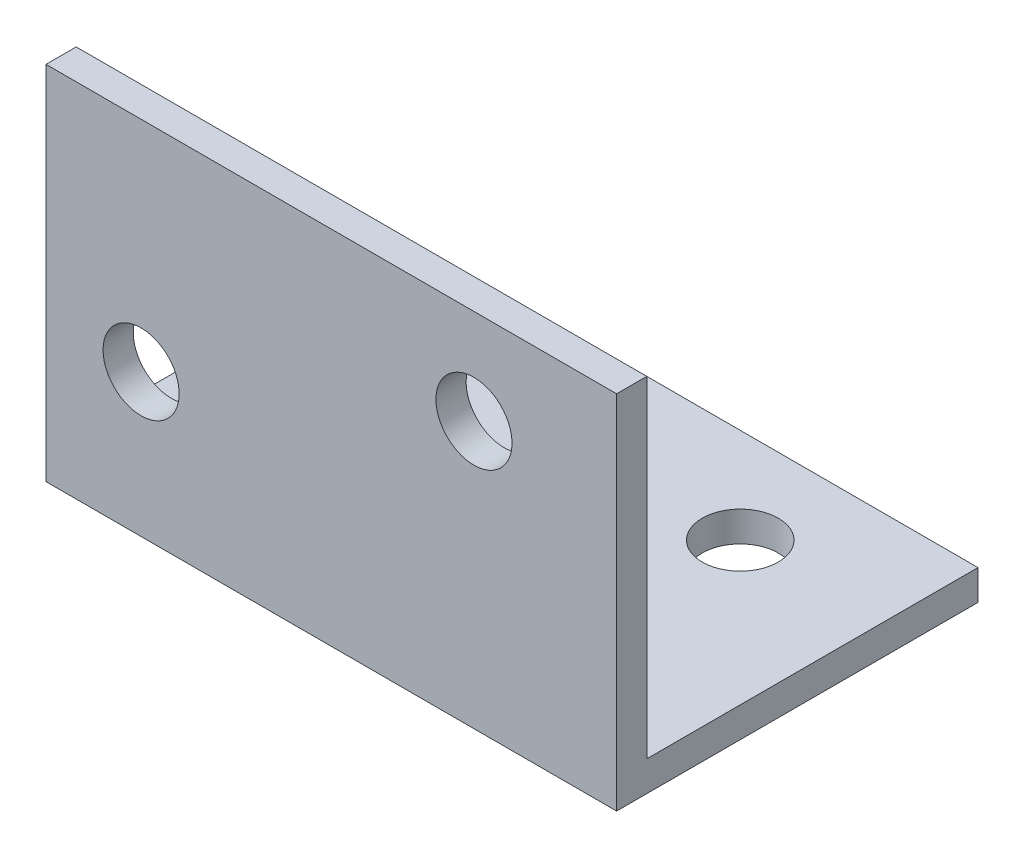
ISO-10303-21;
HEADER;
FILE_DESCRIPTION(('STEP AP214'),'2;1');
FILE_NAME('part.step','',(''),(''),'','','');
FILE_SCHEMA(('AUTOMOTIVE_DESIGN { 1 0 10303 214 1 1 1 1 }'));
ENDSEC;
DATA;
#1=APPLICATION_CONTEXT('core data for automotive mechanical design processes');
#2=APPLICATION_PROTOCOL_DEFINITION('international standard','automotive_design',2000,#1);
#3=PRODUCT_CONTEXT('',#1,'mechanical');
#4=PRODUCT('Part','Part','',(#3));
#5=PRODUCT_RELATED_PRODUCT_CATEGORY('part','',(#4));
#6=PRODUCT_DEFINITION_FORMATION('','',#4);
#7=PRODUCT_DEFINITION_CONTEXT('part definition',#1,'design');
#8=PRODUCT_DEFINITION('design','',#6,#7);
#9=PRODUCT_DEFINITION_SHAPE('','',#8);
#10=(LENGTH_UNIT() NAMED_UNIT(*) SI_UNIT(.MILLI.,.METRE.));
#11=(NAMED_UNIT(*) PLANE_ANGLE_UNIT() SI_UNIT($,.RADIAN.));
#12=(NAMED_UNIT(*) SI_UNIT($,.STERADIAN.) SOLID_ANGLE_UNIT());
#13=UNCERTAINTY_MEASURE_WITH_UNIT(LENGTH_MEASURE(1.E-05),#10,'distance_accuracy_value','');
#14=(GEOMETRIC_REPRESENTATION_CONTEXT(3) GLOBAL_UNCERTAINTY_ASSIGNED_CONTEXT((#13)) GLOBAL_UNIT_ASSIGNED_CONTEXT((#10,
#11,#12)) REPRESENTATION_CONTEXT('',''));
#15=CARTESIAN_POINT('',(0.,0.,0.));
#16=DIRECTION('',(0.,0.,1.));
#17=DIRECTION('',(1.,0.,0.));
#18=AXIS2_PLACEMENT_3D('',#15,#16,#17);
#19=CARTESIAN_POINT('',(0.,0.,3.175));
#20=DIRECTION('',(1.,0.,0.));
#21=DIRECTION('',(0.,0.,-1.));
#22=AXIS2_PLACEMENT_3D('',#19,#20,#21);
#23=PLANE('',#22);
#24=DIRECTION('',(0.,-1.,0.));
#25=VECTOR('',#24,1.);
#26=CARTESIAN_POINT('',(0.,0.,0.));
#27=LINE('',#26,#25);
#28=CARTESIAN_POINT('',(0.,38.,0.));
#29=VERTEX_POINT('',#28);
#30=CARTESIAN_POINT('',(0.,3.175,0.));
#31=VERTEX_POINT('',#30);
#32=EDGE_CURVE('E143',#29,#31,#27,.T.);
#33=ORIENTED_EDGE('',*,*,#32,.T.);
#34=DIRECTION('',(0.,0.,1.));
#35=VECTOR('',#34,1.);
#36=CARTESIAN_POINT('',(0.,3.175,-34.825));
#37=LINE('',#36,#35);
#38=CARTESIAN_POINT('',(0.,3.175,-34.825));
#39=VERTEX_POINT('',#38);
#40=EDGE_CURVE('E139',#39,#31,#37,.T.);
#41=ORIENTED_EDGE('',*,*,#40,.F.);
#42=DIRECTION('',(0.,1.,0.));
#43=VECTOR('',#42,1.);
#44=CARTESIAN_POINT('',(0.,0.,-34.825));
#45=LINE('',#44,#43);
#46=CARTESIAN_POINT('',(0.,0.,-34.825));
#47=VERTEX_POINT('',#46);
#48=EDGE_CURVE('E117',#47,#39,#45,.T.);
#49=ORIENTED_EDGE('',*,*,#48,.F.);
#50=DIRECTION('',(0.,0.,-1.));
#51=VECTOR('',#50,1.);
#52=CARTESIAN_POINT('',(0.,0.,3.175));
#53=LINE('',#52,#51);
#54=CARTESIAN_POINT('',(0.,0.,3.175));
#55=VERTEX_POINT('',#54);
#56=EDGE_CURVE('E11',#55,#47,#53,.T.);
#57=ORIENTED_EDGE('',*,*,#56,.F.);
#58=DIRECTION('',(0.,-1.,0.));
#59=VECTOR('',#58,1.);
#60=CARTESIAN_POINT('',(0.,0.,3.175));
#61=LINE('',#60,#59);
#62=CARTESIAN_POINT('',(0.,38.,3.175));
#63=VERTEX_POINT('',#62);
#64=EDGE_CURVE('E144',#63,#55,#61,.T.);
#65=ORIENTED_EDGE('',*,*,#64,.F.);
#66=DIRECTION('',(0.,0.,-1.));
#67=VECTOR('',#66,1.);
#68=CARTESIAN_POINT('',(0.,38.,3.175));
#69=LINE('',#68,#67);
#70=EDGE_CURVE('E153',#63,#29,#69,.T.);
#71=ORIENTED_EDGE('',*,*,#70,.T.);
#72=EDGE_LOOP('',(#33,#41,#49,#57,#65,#71));
#73=FACE_BOUND('',#72,.T.);
#74=ADVANCED_FACE('F39',(#73),#23,.F.);
#75=CARTESIAN_POINT('',(0.,0.,3.175));
#76=DIRECTION('',(0.,1.,0.));
#77=DIRECTION('',(0.,0.,1.));
#78=AXIS2_PLACEMENT_3D('',#75,#76,#77);
#79=PLANE('',#78);
#80=CARTESIAN_POINT('',(45.,0.,-24.825));
#81=DIRECTION('',(0.,1.,0.));
#82=DIRECTION('',(-1.,0.,0.));
#83=AXIS2_PLACEMENT_3D('',#80,#81,#82);
#84=CIRCLE('',#83,4.);
#85=CARTESIAN_POINT('',(41.,0.,-24.825));
#86=VERTEX_POINT('',#85);
#87=EDGE_CURVE('E217',#86,#86,#84,.T.);
#88=ORIENTED_EDGE('',*,*,#87,.T.);
#89=EDGE_LOOP('',(#88));
#90=FACE_BOUND('',#89,.T.);
#91=CARTESIAN_POINT('',(10.,0.,-11.825));
#92=DIRECTION('',(0.,1.,0.));
#93=DIRECTION('',(-1.,0.,0.));
#94=AXIS2_PLACEMENT_3D('',#91,#92,#93);
#95=CIRCLE('',#94,4.);
#96=CARTESIAN_POINT('',(6.,0.,-11.825));
#97=VERTEX_POINT('',#96);
#98=EDGE_CURVE('E225',#97,#97,#95,.T.);
#99=ORIENTED_EDGE('',*,*,#98,.T.);
#100=EDGE_LOOP('',(#99));
#101=FACE_BOUND('',#100,.T.);
#102=ORIENTED_EDGE('',*,*,#56,.T.);
#103=DIRECTION('',(-1.,0.,0.));
#104=VECTOR('',#103,1.);
#105=CARTESIAN_POINT('',(60.,0.,-34.825));
#106=LINE('',#105,#104);
#107=CARTESIAN_POINT('',(60.,0.,-34.825));
#108=VERTEX_POINT('',#107);
#109=EDGE_CURVE('E111',#108,#47,#106,.T.);
#110=ORIENTED_EDGE('',*,*,#109,.F.);
#111=DIRECTION('',(0.,0.,-1.));
#112=VECTOR('',#111,1.);
#113=CARTESIAN_POINT('',(60.,0.,3.175));
#114=LINE('',#113,#112);
#115=CARTESIAN_POINT('',(60.,0.,3.175));
#116=VERTEX_POINT('',#115);
#117=EDGE_CURVE('E47',#116,#108,#114,.T.);
#118=ORIENTED_EDGE('',*,*,#117,.F.);
#119=DIRECTION('',(1.,0.,0.));
#120=VECTOR('',#119,1.);
#121=CARTESIAN_POINT('',(0.,0.,3.175));
#122=LINE('',#121,#120);
#123=EDGE_CURVE('E85',#55,#116,#122,.T.);
#124=ORIENTED_EDGE('',*,*,#123,.F.);
#125=EDGE_LOOP('',(#102,#110,#118,#124));
#126=FACE_BOUND('',#125,.T.);
#127=ADVANCED_FACE('F112',(#90,#101,#126),#79,.F.);
#128=CARTESIAN_POINT('',(60.,0.,3.175));
#129=DIRECTION('',(-1.,0.,0.));
#130=DIRECTION('',(0.,0.,1.));
#131=AXIS2_PLACEMENT_3D('',#128,#129,#130);
#132=PLANE('',#131);
#133=ORIENTED_EDGE('',*,*,#117,.T.);
#134=DIRECTION('',(0.,-1.,0.));
#135=VECTOR('',#134,1.);
#136=CARTESIAN_POINT('',(60.,0.,-34.825));
#137=LINE('',#136,#135);
#138=CARTESIAN_POINT('',(60.,3.175,-34.825));
#139=VERTEX_POINT('',#138);
#140=EDGE_CURVE('E105',#139,#108,#137,.T.);
#141=ORIENTED_EDGE('',*,*,#140,.F.);
#142=DIRECTION('',(0.,0.,1.));
#143=VECTOR('',#142,1.);
#144=CARTESIAN_POINT('',(60.,3.175,-34.825));
#145=LINE('',#144,#143);
#146=CARTESIAN_POINT('',(60.,3.175,0.));
#147=VERTEX_POINT('',#146);
#148=EDGE_CURVE('E135',#139,#147,#145,.T.);
#149=ORIENTED_EDGE('',*,*,#148,.T.);
#150=DIRECTION('',(0.,1.,0.));
#151=VECTOR('',#150,1.);
#152=CARTESIAN_POINT('',(60.,0.,0.));
#153=LINE('',#152,#151);
#154=CARTESIAN_POINT('',(60.,38.,0.));
#155=VERTEX_POINT('',#154);
#156=EDGE_CURVE('E156',#147,#155,#153,.T.);
#157=ORIENTED_EDGE('',*,*,#156,.T.);
#158=DIRECTION('',(0.,0.,-1.));
#159=VECTOR('',#158,1.);
#160=CARTESIAN_POINT('',(60.,38.,3.175));
#161=LINE('',#160,#159);
#162=CARTESIAN_POINT('',(60.,38.,3.175));
#163=VERTEX_POINT('',#162);
#164=EDGE_CURVE('E109',#163,#155,#161,.T.);
#165=ORIENTED_EDGE('',*,*,#164,.F.);
#166=DIRECTION('',(0.,1.,0.));
#167=VECTOR('',#166,1.);
#168=CARTESIAN_POINT('',(60.,0.,3.175));
#169=LINE('',#168,#167);
#170=EDGE_CURVE('E107',#116,#163,#169,.T.);
#171=ORIENTED_EDGE('',*,*,#170,.F.);
#172=EDGE_LOOP('',(#133,#141,#149,#157,#165,#171));
#173=FACE_BOUND('',#172,.T.);
#174=ADVANCED_FACE('F102',(#173),#132,.F.);
#175=CARTESIAN_POINT('',(0.,38.,3.175));
#176=DIRECTION('',(0.,-1.,0.));
#177=DIRECTION('',(0.,0.,-1.));
#178=AXIS2_PLACEMENT_3D('',#175,#176,#177);
#179=PLANE('',#178);
#180=DIRECTION('',(-1.,0.,0.));
#181=VECTOR('',#180,1.);
#182=CARTESIAN_POINT('',(0.,38.,0.));
#183=LINE('',#182,#181);
#184=EDGE_CURVE('E78',#155,#29,#183,.T.);
#185=ORIENTED_EDGE('',*,*,#184,.T.);
#186=ORIENTED_EDGE('',*,*,#70,.F.);
#187=DIRECTION('',(-1.,0.,0.));
#188=VECTOR('',#187,1.);
#189=CARTESIAN_POINT('',(0.,38.,3.175));
#190=LINE('',#189,#188);
#191=EDGE_CURVE('E63',#163,#63,#190,.T.);
#192=ORIENTED_EDGE('',*,*,#191,.F.);
#193=ORIENTED_EDGE('',*,*,#164,.T.);
#194=EDGE_LOOP('',(#185,#186,#192,#193));
#195=FACE_BOUND('',#194,.T.);
#196=ADVANCED_FACE('F164',(#195),#179,.F.);
#197=CARTESIAN_POINT('',(0.,0.,3.175));
#198=DIRECTION('',(0.,0.,-1.));
#199=DIRECTION('',(-1.,0.,0.));
#200=AXIS2_PLACEMENT_3D('',#197,#198,#199);
#201=PLANE('',#200);
#202=CARTESIAN_POINT('',(45.,28.,3.175));
#203=DIRECTION('',(0.,0.,-1.));
#204=DIRECTION('',(-1.,0.,0.));
#205=AXIS2_PLACEMENT_3D('',#202,#203,#204);
#206=CIRCLE('',#205,4.00000000000001);
#207=CARTESIAN_POINT('',(41.,28.,3.175));
#208=VERTEX_POINT('',#207);
#209=EDGE_CURVE('E126',#208,#208,#206,.T.);
#210=ORIENTED_EDGE('',*,*,#209,.T.);
#211=EDGE_LOOP('',(#210));
#212=FACE_BOUND('',#211,.T.);
#213=CARTESIAN_POINT('',(10.,15.,3.175));
#214=DIRECTION('',(0.,0.,-1.));
#215=DIRECTION('',(-1.,0.,0.));
#216=AXIS2_PLACEMENT_3D('',#213,#214,#215);
#217=CIRCLE('',#216,4.);
#218=CARTESIAN_POINT('',(6.,15.,3.175));
#219=VERTEX_POINT('',#218);
#220=EDGE_CURVE('E208',#219,#219,#217,.T.);
#221=ORIENTED_EDGE('',*,*,#220,.T.);
#222=EDGE_LOOP('',(#221));
#223=FACE_BOUND('',#222,.T.);
#224=ORIENTED_EDGE('',*,*,#64,.T.);
#225=ORIENTED_EDGE('',*,*,#123,.T.);
#226=ORIENTED_EDGE('',*,*,#170,.T.);
#227=ORIENTED_EDGE('',*,*,#191,.T.);
#228=EDGE_LOOP('',(#224,#225,#226,#227));
#229=FACE_BOUND('',#228,.T.);
#230=ADVANCED_FACE('F180',(#212,#223,#229),#201,.F.);
#231=CARTESIAN_POINT('',(0.,0.,0.));
#232=DIRECTION('',(0.,0.,-1.));
#233=DIRECTION('',(-1.,0.,0.));
#234=AXIS2_PLACEMENT_3D('',#231,#232,#233);
#235=PLANE('',#234);
#236=CARTESIAN_POINT('',(45.,28.,0.));
#237=DIRECTION('',(0.,0.,-1.));
#238=DIRECTION('',(-1.,0.,0.));
#239=AXIS2_PLACEMENT_3D('',#236,#237,#238);
#240=CIRCLE('',#239,4.00000000000001);
#241=CARTESIAN_POINT('',(41.,28.,0.));
#242=VERTEX_POINT('',#241);
#243=EDGE_CURVE('E211',#242,#242,#240,.T.);
#244=ORIENTED_EDGE('',*,*,#243,.F.);
#245=EDGE_LOOP('',(#244));
#246=FACE_BOUND('',#245,.T.);
#247=CARTESIAN_POINT('',(10.,15.,0.));
#248=DIRECTION('',(0.,0.,-1.));
#249=DIRECTION('',(-1.,0.,0.));
#250=AXIS2_PLACEMENT_3D('',#247,#248,#249);
#251=CIRCLE('',#250,4.);
#252=CARTESIAN_POINT('',(6.,15.,0.));
#253=VERTEX_POINT('',#252);
#254=EDGE_CURVE('E129',#253,#253,#251,.T.);
#255=ORIENTED_EDGE('',*,*,#254,.F.);
#256=EDGE_LOOP('',(#255));
#257=FACE_BOUND('',#256,.T.);
#258=DIRECTION('',(1.,0.,0.));
#259=VECTOR('',#258,1.);
#260=CARTESIAN_POINT('',(60.,3.175,0.));
#261=LINE('',#260,#259);
#262=EDGE_CURVE('E54',#31,#147,#261,.T.);
#263=ORIENTED_EDGE('',*,*,#262,.F.);
#264=ORIENTED_EDGE('',*,*,#32,.F.);
#265=ORIENTED_EDGE('',*,*,#184,.F.);
#266=ORIENTED_EDGE('',*,*,#156,.F.);
#267=EDGE_LOOP('',(#263,#264,#265,#266));
#268=FACE_BOUND('',#267,.T.);
#269=ADVANCED_FACE('F165',(#246,#257,#268),#235,.T.);
#270=CARTESIAN_POINT('',(60.,3.175,-34.825));
#271=DIRECTION('',(0.,-1.,0.));
#272=DIRECTION('',(1.,0.,0.));
#273=AXIS2_PLACEMENT_3D('',#270,#271,#272);
#274=PLANE('',#273);
#275=CARTESIAN_POINT('',(45.,3.175,-24.825));
#276=DIRECTION('',(0.,1.,0.));
#277=DIRECTION('',(-1.,0.,0.));
#278=AXIS2_PLACEMENT_3D('',#275,#276,#277);
#279=CIRCLE('',#278,4.);
#280=CARTESIAN_POINT('',(41.,3.175,-24.825));
#281=VERTEX_POINT('',#280);
#282=EDGE_CURVE('E229',#281,#281,#279,.T.);
#283=ORIENTED_EDGE('',*,*,#282,.F.);
#284=EDGE_LOOP('',(#283));
#285=FACE_BOUND('',#284,.T.);
#286=CARTESIAN_POINT('',(10.,3.175,-11.825));
#287=DIRECTION('',(0.,1.,0.));
#288=DIRECTION('',(-1.,0.,0.));
#289=AXIS2_PLACEMENT_3D('',#286,#287,#288);
#290=CIRCLE('',#289,4.);
#291=CARTESIAN_POINT('',(6.,3.175,-11.825));
#292=VERTEX_POINT('',#291);
#293=EDGE_CURVE('E221',#292,#292,#290,.T.);
#294=ORIENTED_EDGE('',*,*,#293,.F.);
#295=EDGE_LOOP('',(#294));
#296=FACE_BOUND('',#295,.T.);
#297=ORIENTED_EDGE('',*,*,#262,.T.);
#298=ORIENTED_EDGE('',*,*,#148,.F.);
#299=DIRECTION('',(1.,0.,0.));
#300=VECTOR('',#299,1.);
#301=CARTESIAN_POINT('',(60.,3.175,-34.825));
#302=LINE('',#301,#300);
#303=EDGE_CURVE('E121',#39,#139,#302,.T.);
#304=ORIENTED_EDGE('',*,*,#303,.F.);
#305=ORIENTED_EDGE('',*,*,#40,.T.);
#306=EDGE_LOOP('',(#297,#298,#304,#305));
#307=FACE_BOUND('',#306,.T.);
#308=ADVANCED_FACE('F170',(#285,#296,#307),#274,.F.);
#309=CARTESIAN_POINT('',(0.,0.,-34.825));
#310=DIRECTION('',(0.,0.,1.));
#311=DIRECTION('',(1.,0.,0.));
#312=AXIS2_PLACEMENT_3D('',#309,#310,#311);
#313=PLANE('',#312);
#314=ORIENTED_EDGE('',*,*,#140,.T.);
#315=ORIENTED_EDGE('',*,*,#109,.T.);
#316=ORIENTED_EDGE('',*,*,#48,.T.);
#317=ORIENTED_EDGE('',*,*,#303,.T.);
#318=EDGE_LOOP('',(#314,#315,#316,#317));
#319=FACE_BOUND('',#318,.T.);
#320=ADVANCED_FACE('F119',(#319),#313,.F.);
#321=CARTESIAN_POINT('',(10.,15.,3.175));
#322=DIRECTION('',(0.,0.,-1.));
#323=DIRECTION('',(-1.,0.,0.));
#324=AXIS2_PLACEMENT_3D('',#321,#322,#323);
#325=CYLINDRICAL_SURFACE('',#324,4.);
#326=ORIENTED_EDGE('',*,*,#220,.F.);
#327=EDGE_LOOP('',(#326));
#328=FACE_BOUND('',#327,.T.);
#329=ORIENTED_EDGE('',*,*,#254,.T.);
#330=EDGE_LOOP('',(#329));
#331=FACE_BOUND('',#330,.T.);
#332=ADVANCED_FACE('F178',(#328,#331),#325,.F.);
#333=CARTESIAN_POINT('',(45.,28.,3.175));
#334=DIRECTION('',(0.,0.,-1.));
#335=DIRECTION('',(-1.,0.,0.));
#336=AXIS2_PLACEMENT_3D('',#333,#334,#335);
#337=CYLINDRICAL_SURFACE('',#336,4.00000000000001);
#338=ORIENTED_EDGE('',*,*,#209,.F.);
#339=EDGE_LOOP('',(#338));
#340=FACE_BOUND('',#339,.T.);
#341=ORIENTED_EDGE('',*,*,#243,.T.);
#342=EDGE_LOOP('',(#341));
#343=FACE_BOUND('',#342,.T.);
#344=ADVANCED_FACE('F244',(#340,#343),#337,.F.);
#345=CARTESIAN_POINT('',(10.,0.,-11.825));
#346=DIRECTION('',(0.,1.,0.));
#347=DIRECTION('',(-1.,0.,0.));
#348=AXIS2_PLACEMENT_3D('',#345,#346,#347);
#349=CYLINDRICAL_SURFACE('',#348,4.);
#350=ORIENTED_EDGE('',*,*,#98,.F.);
#351=EDGE_LOOP('',(#350));
#352=FACE_BOUND('',#351,.T.);
#353=ORIENTED_EDGE('',*,*,#293,.T.);
#354=EDGE_LOOP('',(#353));
#355=FACE_BOUND('',#354,.T.);
#356=ADVANCED_FACE('F239',(#352,#355),#349,.F.);
#357=CARTESIAN_POINT('',(45.,0.,-24.825));
#358=DIRECTION('',(0.,1.,0.));
#359=DIRECTION('',(-1.,0.,0.));
#360=AXIS2_PLACEMENT_3D('',#357,#358,#359);
#361=CYLINDRICAL_SURFACE('',#360,4.);
#362=ORIENTED_EDGE('',*,*,#87,.F.);
#363=EDGE_LOOP('',(#362));
#364=FACE_BOUND('',#363,.T.);
#365=ORIENTED_EDGE('',*,*,#282,.T.);
#366=EDGE_LOOP('',(#365));
#367=FACE_BOUND('',#366,.T.);
#368=ADVANCED_FACE('F236',(#364,#367),#361,.F.);
#369=CLOSED_SHELL('',(#74,#127,#174,#196,#230,#269,#308,#320,#332,#344,#356,#368));
#370=MANIFOLD_SOLID_BREP('B2',#369);
#371=ADVANCED_BREP_SHAPE_REPRESENTATION('',(#18,#370),#14);
#372=SHAPE_DEFINITION_REPRESENTATION(#9,#371);
ENDSEC;
END-ISO-10303-21;
